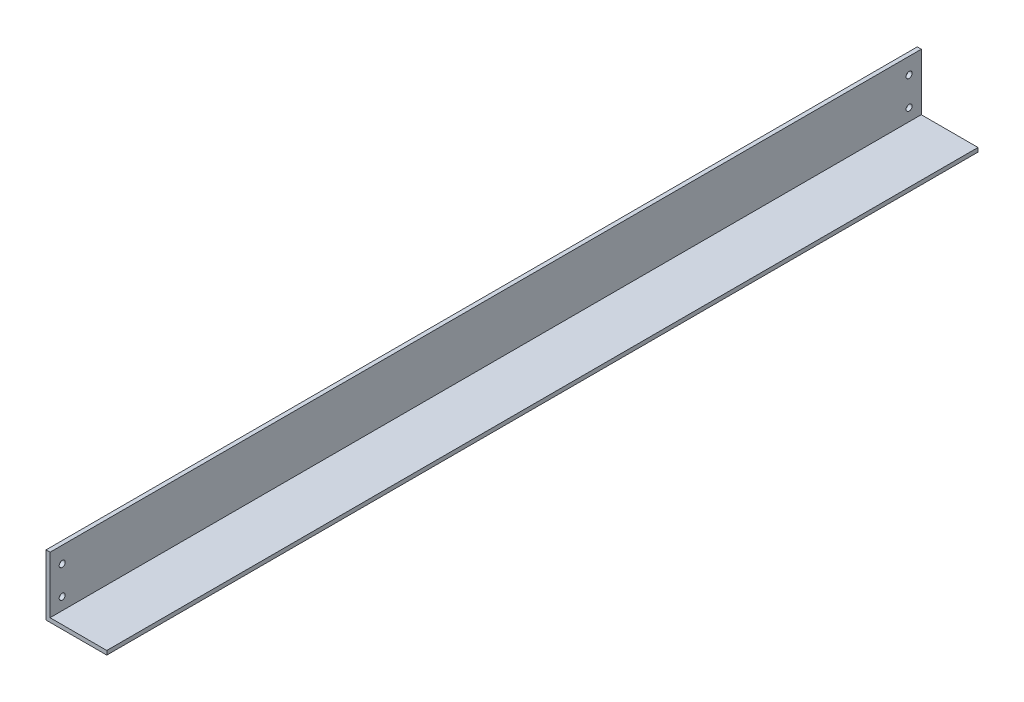
ISO-10303-21;
HEADER;
FILE_DESCRIPTION(('STEP AP214'),'2;1');
FILE_NAME('part.step','',(''),(''),'','','');
FILE_SCHEMA(('AUTOMOTIVE_DESIGN { 1 0 10303 214 1 1 1 1 }'));
ENDSEC;
DATA;
#1=APPLICATION_CONTEXT('core data for automotive mechanical design processes');
#2=APPLICATION_PROTOCOL_DEFINITION('international standard','automotive_design',2000,#1);
#3=PRODUCT_CONTEXT('',#1,'mechanical');
#4=PRODUCT('Part','Part','',(#3));
#5=PRODUCT_RELATED_PRODUCT_CATEGORY('part','',(#4));
#6=PRODUCT_DEFINITION_FORMATION('','',#4);
#7=PRODUCT_DEFINITION_CONTEXT('part definition',#1,'design');
#8=PRODUCT_DEFINITION('design','',#6,#7);
#9=PRODUCT_DEFINITION_SHAPE('','',#8);
#10=(LENGTH_UNIT() NAMED_UNIT(*) SI_UNIT(.MILLI.,.METRE.));
#11=(NAMED_UNIT(*) PLANE_ANGLE_UNIT() SI_UNIT($,.RADIAN.));
#12=(NAMED_UNIT(*) SI_UNIT($,.STERADIAN.) SOLID_ANGLE_UNIT());
#13=UNCERTAINTY_MEASURE_WITH_UNIT(LENGTH_MEASURE(1.E-05),#10,'distance_accuracy_value','');
#14=(GEOMETRIC_REPRESENTATION_CONTEXT(3) GLOBAL_UNCERTAINTY_ASSIGNED_CONTEXT((#13)) GLOBAL_UNIT_ASSIGNED_CONTEXT((#10,
#11,#12)) REPRESENTATION_CONTEXT('',''));
#15=CARTESIAN_POINT('',(0.,0.,0.));
#16=DIRECTION('',(0.,0.,1.));
#17=DIRECTION('',(1.,0.,0.));
#18=AXIS2_PLACEMENT_3D('',#15,#16,#17);
#19=CARTESIAN_POINT('',(30.,5.60231842899837,-19.999999999968));
#20=DIRECTION('',(0.,-1.,0.));
#21=DIRECTION('',(1.,0.,0.));
#22=AXIS2_PLACEMENT_3D('',#19,#20,#21);
#23=PLANE('',#22);
#24=DIRECTION('',(0.,0.,1.));
#25=VECTOR('',#24,1.);
#26=CARTESIAN_POINT('',(30.,5.60231842899837,-19.999999999968));
#27=LINE('',#26,#25);
#28=CARTESIAN_POINT('',(30.,5.60231842899837,-19.999999999968));
#29=VERTEX_POINT('',#28);
#30=CARTESIAN_POINT('',(30.,5.60231842899837,410.));
#31=VERTEX_POINT('',#30);
#32=EDGE_CURVE('E40',#29,#31,#27,.T.);
#33=ORIENTED_EDGE('',*,*,#32,.T.);
#34=DIRECTION('',(1.,0.,0.));
#35=VECTOR('',#34,1.);
#36=CARTESIAN_POINT('',(30.,5.60231842899837,410.));
#37=LINE('',#36,#35);
#38=CARTESIAN_POINT('',(0.,5.60231842899837,410.));
#39=VERTEX_POINT('',#38);
#40=EDGE_CURVE('E89',#39,#31,#37,.T.);
#41=ORIENTED_EDGE('',*,*,#40,.F.);
#42=DIRECTION('',(0.,0.,1.));
#43=VECTOR('',#42,1.);
#44=CARTESIAN_POINT('',(0.,5.60231842899837,-19.999999999968));
#45=LINE('',#44,#43);
#46=CARTESIAN_POINT('',(0.,5.60231842899837,-19.999999999968));
#47=VERTEX_POINT('',#46);
#48=EDGE_CURVE('E11',#47,#39,#45,.T.);
#49=ORIENTED_EDGE('',*,*,#48,.F.);
#50=DIRECTION('',(1.,0.,0.));
#51=VECTOR('',#50,1.);
#52=CARTESIAN_POINT('',(30.,5.60231842899837,-19.999999999968));
#53=LINE('',#52,#51);
#54=EDGE_CURVE('E90',#47,#29,#53,.T.);
#55=ORIENTED_EDGE('',*,*,#54,.T.);
#56=EDGE_LOOP('',(#33,#41,#49,#55));
#57=FACE_BOUND('',#56,.T.);
#58=ADVANCED_FACE('F37',(#57),#23,.T.);
#59=CARTESIAN_POINT('',(0.,5.60231842899837,-19.999999999968));
#60=DIRECTION('',(-1.,0.,0.));
#61=DIRECTION('',(0.,0.,1.));
#62=AXIS2_PLACEMENT_3D('',#59,#60,#61);
#63=PLANE('',#62);
#64=CARTESIAN_POINT('',(0.,13.6023184289983,404.));
#65=DIRECTION('',(1.,0.,0.));
#66=DIRECTION('',(0.,0.,-1.));
#67=AXIS2_PLACEMENT_3D('',#64,#65,#66);
#68=CIRCLE('',#67,1.49999999999999);
#69=CARTESIAN_POINT('',(0.,13.6023184289983,402.5));
#70=VERTEX_POINT('',#69);
#71=EDGE_CURVE('E200',#70,#70,#68,.T.);
#72=ORIENTED_EDGE('',*,*,#71,.T.);
#73=EDGE_LOOP('',(#72));
#74=FACE_BOUND('',#73,.T.);
#75=CARTESIAN_POINT('',(0.,27.6023184289983,404.));
#76=DIRECTION('',(1.,0.,0.));
#77=DIRECTION('',(0.,0.,-1.));
#78=AXIS2_PLACEMENT_3D('',#75,#76,#77);
#79=CIRCLE('',#78,1.49999999999999);
#80=CARTESIAN_POINT('',(0.,27.6023184289983,402.5));
#81=VERTEX_POINT('',#80);
#82=EDGE_CURVE('E210',#81,#81,#79,.T.);
#83=ORIENTED_EDGE('',*,*,#82,.T.);
#84=EDGE_LOOP('',(#83));
#85=FACE_BOUND('',#84,.T.);
#86=CARTESIAN_POINT('',(0.,27.6023184289984,-14.0000000000001));
#87=DIRECTION('',(-1.,0.,0.));
#88=DIRECTION('',(0.,0.,1.));
#89=AXIS2_PLACEMENT_3D('',#86,#87,#88);
#90=CIRCLE('',#89,1.49999999999999);
#91=CARTESIAN_POINT('',(0.,27.6023184289984,-12.5000000000001));
#92=VERTEX_POINT('',#91);
#93=EDGE_CURVE('E213',#92,#92,#90,.T.);
#94=ORIENTED_EDGE('',*,*,#93,.F.);
#95=EDGE_LOOP('',(#94));
#96=FACE_BOUND('',#95,.T.);
#97=CARTESIAN_POINT('',(0.,13.6023184289984,-14.0000000000001));
#98=DIRECTION('',(-1.,0.,0.));
#99=DIRECTION('',(0.,0.,1.));
#100=AXIS2_PLACEMENT_3D('',#97,#98,#99);
#101=CIRCLE('',#100,1.49999999999999);
#102=CARTESIAN_POINT('',(0.,13.6023184289984,-12.5000000000001));
#103=VERTEX_POINT('',#102);
#104=EDGE_CURVE('E111',#103,#103,#101,.T.);
#105=ORIENTED_EDGE('',*,*,#104,.F.);
#106=EDGE_LOOP('',(#105));
#107=FACE_BOUND('',#106,.T.);
#108=ORIENTED_EDGE('',*,*,#48,.T.);
#109=DIRECTION('',(0.,-1.,0.));
#110=VECTOR('',#109,1.);
#111=CARTESIAN_POINT('',(0.,5.60231842899837,410.));
#112=LINE('',#111,#110);
#113=CARTESIAN_POINT('',(0.,35.6023184289984,410.));
#114=VERTEX_POINT('',#113);
#115=EDGE_CURVE('E107',#114,#39,#112,.T.);
#116=ORIENTED_EDGE('',*,*,#115,.F.);
#117=DIRECTION('',(0.,0.,1.));
#118=VECTOR('',#117,1.);
#119=CARTESIAN_POINT('',(0.,35.6023184289984,-19.999999999968));
#120=LINE('',#119,#118);
#121=CARTESIAN_POINT('',(0.,35.6023184289984,-19.999999999968));
#122=VERTEX_POINT('',#121);
#123=EDGE_CURVE('E45',#122,#114,#120,.T.);
#124=ORIENTED_EDGE('',*,*,#123,.F.);
#125=DIRECTION('',(0.,-1.,0.));
#126=VECTOR('',#125,1.);
#127=CARTESIAN_POINT('',(0.,5.60231842899837,-19.999999999968));
#128=LINE('',#127,#126);
#129=EDGE_CURVE('E95',#122,#47,#128,.T.);
#130=ORIENTED_EDGE('',*,*,#129,.T.);
#131=EDGE_LOOP('',(#108,#116,#124,#130));
#132=FACE_BOUND('',#131,.T.);
#133=ADVANCED_FACE('F152',(#74,#85,#96,#107,#132),#63,.T.);
#134=CARTESIAN_POINT('',(0.,35.6023184289984,-19.999999999968));
#135=DIRECTION('',(0.,1.,0.));
#136=DIRECTION('',(0.,0.,1.));
#137=AXIS2_PLACEMENT_3D('',#134,#135,#136);
#138=PLANE('',#137);
#139=ORIENTED_EDGE('',*,*,#123,.T.);
#140=DIRECTION('',(-1.,0.,0.));
#141=VECTOR('',#140,1.);
#142=CARTESIAN_POINT('',(0.,35.6023184289984,410.));
#143=LINE('',#142,#141);
#144=CARTESIAN_POINT('',(2.,35.6023184289984,410.));
#145=VERTEX_POINT('',#144);
#146=EDGE_CURVE('E119',#145,#114,#143,.T.);
#147=ORIENTED_EDGE('',*,*,#146,.F.);
#148=DIRECTION('',(0.,0.,1.));
#149=VECTOR('',#148,1.);
#150=CARTESIAN_POINT('',(2.,35.6023184289984,-19.999999999968));
#151=LINE('',#150,#149);
#152=CARTESIAN_POINT('',(2.,35.6023184289984,-19.999999999968));
#153=VERTEX_POINT('',#152);
#154=EDGE_CURVE('E135',#153,#145,#151,.T.);
#155=ORIENTED_EDGE('',*,*,#154,.F.);
#156=DIRECTION('',(-1.,0.,0.));
#157=VECTOR('',#156,1.);
#158=CARTESIAN_POINT('',(0.,35.6023184289984,-19.999999999968));
#159=LINE('',#158,#157);
#160=EDGE_CURVE('E131',#153,#122,#159,.T.);
#161=ORIENTED_EDGE('',*,*,#160,.T.);
#162=EDGE_LOOP('',(#139,#147,#155,#161));
#163=FACE_BOUND('',#162,.T.);
#164=ADVANCED_FACE('F148',(#163),#138,.T.);
#165=CARTESIAN_POINT('',(2.,35.6023184289984,-19.999999999968));
#166=DIRECTION('',(1.,0.,0.));
#167=DIRECTION('',(0.,1.,0.));
#168=AXIS2_PLACEMENT_3D('',#165,#166,#167);
#169=PLANE('',#168);
#170=CARTESIAN_POINT('',(1.99999999999997,13.6023184289983,404.));
#171=DIRECTION('',(1.,0.,0.));
#172=DIRECTION('',(0.,0.,-1.));
#173=AXIS2_PLACEMENT_3D('',#170,#171,#172);
#174=CIRCLE('',#173,1.49999999999999);
#175=CARTESIAN_POINT('',(1.99999999999997,13.6023184289983,402.5));
#176=VERTEX_POINT('',#175);
#177=EDGE_CURVE('E203',#176,#176,#174,.T.);
#178=ORIENTED_EDGE('',*,*,#177,.F.);
#179=EDGE_LOOP('',(#178));
#180=FACE_BOUND('',#179,.T.);
#181=CARTESIAN_POINT('',(1.99999999999997,27.6023184289983,404.));
#182=DIRECTION('',(1.,0.,0.));
#183=DIRECTION('',(0.,0.,-1.));
#184=AXIS2_PLACEMENT_3D('',#181,#182,#183);
#185=CIRCLE('',#184,1.49999999999999);
#186=CARTESIAN_POINT('',(1.99999999999997,27.6023184289983,402.5));
#187=VERTEX_POINT('',#186);
#188=EDGE_CURVE('E205',#187,#187,#185,.T.);
#189=ORIENTED_EDGE('',*,*,#188,.F.);
#190=EDGE_LOOP('',(#189));
#191=FACE_BOUND('',#190,.T.);
#192=CARTESIAN_POINT('',(2.,27.6023184289984,-14.0000000000001));
#193=DIRECTION('',(1.,0.,0.));
#194=DIRECTION('',(0.,1.,0.));
#195=AXIS2_PLACEMENT_3D('',#192,#193,#194);
#196=CIRCLE('',#195,1.49999999999999);
#197=CARTESIAN_POINT('',(2.,29.1023184289984,-14.0000000000001));
#198=VERTEX_POINT('',#197);
#199=EDGE_CURVE('E216',#198,#198,#196,.T.);
#200=ORIENTED_EDGE('',*,*,#199,.F.);
#201=EDGE_LOOP('',(#200));
#202=FACE_BOUND('',#201,.T.);
#203=CARTESIAN_POINT('',(2.,13.6023184289984,-14.0000000000001));
#204=DIRECTION('',(1.,0.,0.));
#205=DIRECTION('',(0.,1.,0.));
#206=AXIS2_PLACEMENT_3D('',#203,#204,#205);
#207=CIRCLE('',#206,1.49999999999999);
#208=CARTESIAN_POINT('',(2.,15.1023184289984,-14.0000000000001));
#209=VERTEX_POINT('',#208);
#210=EDGE_CURVE('E108',#209,#209,#207,.T.);
#211=ORIENTED_EDGE('',*,*,#210,.F.);
#212=EDGE_LOOP('',(#211));
#213=FACE_BOUND('',#212,.T.);
#214=ORIENTED_EDGE('',*,*,#154,.T.);
#215=DIRECTION('',(0.,1.,0.));
#216=VECTOR('',#215,1.);
#217=CARTESIAN_POINT('',(2.,35.6023184289984,410.));
#218=LINE('',#217,#216);
#219=CARTESIAN_POINT('',(2.,7.60231842899837,410.));
#220=VERTEX_POINT('',#219);
#221=EDGE_CURVE('E116',#220,#145,#218,.T.);
#222=ORIENTED_EDGE('',*,*,#221,.F.);
#223=DIRECTION('',(0.,0.,1.));
#224=VECTOR('',#223,1.);
#225=CARTESIAN_POINT('',(2.,7.60231842899837,-19.999999999968));
#226=LINE('',#225,#224);
#227=CARTESIAN_POINT('',(2.,7.60231842899837,-19.999999999968));
#228=VERTEX_POINT('',#227);
#229=EDGE_CURVE('E137',#228,#220,#226,.T.);
#230=ORIENTED_EDGE('',*,*,#229,.F.);
#231=DIRECTION('',(0.,1.,0.));
#232=VECTOR('',#231,1.);
#233=CARTESIAN_POINT('',(2.,35.6023184289984,-19.999999999968));
#234=LINE('',#233,#232);
#235=EDGE_CURVE('E128',#228,#153,#234,.T.);
#236=ORIENTED_EDGE('',*,*,#235,.T.);
#237=EDGE_LOOP('',(#214,#222,#230,#236));
#238=FACE_BOUND('',#237,.T.);
#239=ADVANCED_FACE('F145',(#180,#191,#202,#213,#238),#169,.T.);
#240=CARTESIAN_POINT('',(2.,7.60231842899837,-19.999999999968));
#241=DIRECTION('',(0.,1.,0.));
#242=DIRECTION('',(0.,0.,1.));
#243=AXIS2_PLACEMENT_3D('',#240,#241,#242);
#244=PLANE('',#243);
#245=ORIENTED_EDGE('',*,*,#229,.T.);
#246=DIRECTION('',(-1.,0.,0.));
#247=VECTOR('',#246,1.);
#248=CARTESIAN_POINT('',(2.,7.60231842899837,410.));
#249=LINE('',#248,#247);
#250=CARTESIAN_POINT('',(30.,7.60231842899837,410.));
#251=VERTEX_POINT('',#250);
#252=EDGE_CURVE('E102',#251,#220,#249,.T.);
#253=ORIENTED_EDGE('',*,*,#252,.F.);
#254=DIRECTION('',(0.,0.,1.));
#255=VECTOR('',#254,1.);
#256=CARTESIAN_POINT('',(30.,7.60231842899837,-19.999999999968));
#257=LINE('',#256,#255);
#258=CARTESIAN_POINT('',(30.,7.60231842899837,-19.999999999968));
#259=VERTEX_POINT('',#258);
#260=EDGE_CURVE('E94',#259,#251,#257,.T.);
#261=ORIENTED_EDGE('',*,*,#260,.F.);
#262=DIRECTION('',(-1.,0.,0.));
#263=VECTOR('',#262,1.);
#264=CARTESIAN_POINT('',(2.,7.60231842899837,-19.999999999968));
#265=LINE('',#264,#263);
#266=EDGE_CURVE('E125',#259,#228,#265,.T.);
#267=ORIENTED_EDGE('',*,*,#266,.T.);
#268=EDGE_LOOP('',(#245,#253,#261,#267));
#269=FACE_BOUND('',#268,.T.);
#270=ADVANCED_FACE('F139',(#269),#244,.T.);
#271=CARTESIAN_POINT('',(30.,7.60231842899837,-19.999999999968));
#272=DIRECTION('',(1.,0.,0.));
#273=DIRECTION('',(0.,0.,-1.));
#274=AXIS2_PLACEMENT_3D('',#271,#272,#273);
#275=PLANE('',#274);
#276=ORIENTED_EDGE('',*,*,#260,.T.);
#277=DIRECTION('',(0.,1.,0.));
#278=VECTOR('',#277,1.);
#279=CARTESIAN_POINT('',(30.,7.60231842899837,410.));
#280=LINE('',#279,#278);
#281=EDGE_CURVE('E97',#31,#251,#280,.T.);
#282=ORIENTED_EDGE('',*,*,#281,.F.);
#283=ORIENTED_EDGE('',*,*,#32,.F.);
#284=DIRECTION('',(0.,1.,0.));
#285=VECTOR('',#284,1.);
#286=CARTESIAN_POINT('',(30.,7.60231842899837,-19.999999999968));
#287=LINE('',#286,#285);
#288=EDGE_CURVE('E123',#29,#259,#287,.T.);
#289=ORIENTED_EDGE('',*,*,#288,.T.);
#290=EDGE_LOOP('',(#276,#282,#283,#289));
#291=FACE_BOUND('',#290,.T.);
#292=ADVANCED_FACE('F98',(#291),#275,.T.);
#293=CARTESIAN_POINT('',(0.,0.,-19.999999999968));
#294=DIRECTION('',(0.,0.,-1.));
#295=DIRECTION('',(-1.,0.,0.));
#296=AXIS2_PLACEMENT_3D('',#293,#294,#295);
#297=PLANE('',#296);
#298=ORIENTED_EDGE('',*,*,#54,.F.);
#299=ORIENTED_EDGE('',*,*,#129,.F.);
#300=ORIENTED_EDGE('',*,*,#160,.F.);
#301=ORIENTED_EDGE('',*,*,#235,.F.);
#302=ORIENTED_EDGE('',*,*,#266,.F.);
#303=ORIENTED_EDGE('',*,*,#288,.F.);
#304=EDGE_LOOP('',(#298,#299,#300,#301,#302,#303));
#305=FACE_BOUND('',#304,.T.);
#306=ADVANCED_FACE('F151',(#305),#297,.T.);
#307=CARTESIAN_POINT('',(0.,0.,410.));
#308=DIRECTION('',(0.,0.,-1.));
#309=DIRECTION('',(-1.,0.,0.));
#310=AXIS2_PLACEMENT_3D('',#307,#308,#309);
#311=PLANE('',#310);
#312=ORIENTED_EDGE('',*,*,#40,.T.);
#313=ORIENTED_EDGE('',*,*,#281,.T.);
#314=ORIENTED_EDGE('',*,*,#252,.T.);
#315=ORIENTED_EDGE('',*,*,#221,.T.);
#316=ORIENTED_EDGE('',*,*,#146,.T.);
#317=ORIENTED_EDGE('',*,*,#115,.T.);
#318=EDGE_LOOP('',(#312,#313,#314,#315,#316,#317));
#319=FACE_BOUND('',#318,.T.);
#320=ADVANCED_FACE('F105',(#319),#311,.F.);
#321=CARTESIAN_POINT('',(0.,13.6023184289984,-14.0000000000001));
#322=DIRECTION('',(-1.,0.,0.));
#323=DIRECTION('',(0.,0.,1.));
#324=AXIS2_PLACEMENT_3D('',#321,#322,#323);
#325=CYLINDRICAL_SURFACE('',#324,1.49999999999999);
#326=ORIENTED_EDGE('',*,*,#210,.T.);
#327=EDGE_LOOP('',(#326));
#328=FACE_BOUND('',#327,.T.);
#329=ORIENTED_EDGE('',*,*,#104,.T.);
#330=EDGE_LOOP('',(#329));
#331=FACE_BOUND('',#330,.T.);
#332=ADVANCED_FACE('F178',(#328,#331),#325,.F.);
#333=CARTESIAN_POINT('',(0.,27.6023184289984,-14.0000000000001));
#334=DIRECTION('',(-1.,0.,0.));
#335=DIRECTION('',(0.,0.,1.));
#336=AXIS2_PLACEMENT_3D('',#333,#334,#335);
#337=CYLINDRICAL_SURFACE('',#336,1.49999999999999);
#338=ORIENTED_EDGE('',*,*,#199,.T.);
#339=EDGE_LOOP('',(#338));
#340=FACE_BOUND('',#339,.T.);
#341=ORIENTED_EDGE('',*,*,#93,.T.);
#342=EDGE_LOOP('',(#341));
#343=FACE_BOUND('',#342,.T.);
#344=ADVANCED_FACE('F182',(#340,#343),#337,.F.);
#345=CARTESIAN_POINT('',(1.99999999999997,27.6023184289983,404.));
#346=DIRECTION('',(1.,0.,0.));
#347=DIRECTION('',(0.,0.,-1.));
#348=AXIS2_PLACEMENT_3D('',#345,#346,#347);
#349=CYLINDRICAL_SURFACE('',#348,1.49999999999999);
#350=ORIENTED_EDGE('',*,*,#82,.F.);
#351=EDGE_LOOP('',(#350));
#352=FACE_BOUND('',#351,.T.);
#353=ORIENTED_EDGE('',*,*,#188,.T.);
#354=EDGE_LOOP('',(#353));
#355=FACE_BOUND('',#354,.T.);
#356=ADVANCED_FACE('F188',(#352,#355),#349,.F.);
#357=CARTESIAN_POINT('',(1.99999999999997,13.6023184289983,404.));
#358=DIRECTION('',(1.,0.,0.));
#359=DIRECTION('',(0.,0.,-1.));
#360=AXIS2_PLACEMENT_3D('',#357,#358,#359);
#361=CYLINDRICAL_SURFACE('',#360,1.49999999999999);
#362=ORIENTED_EDGE('',*,*,#71,.F.);
#363=EDGE_LOOP('',(#362));
#364=FACE_BOUND('',#363,.T.);
#365=ORIENTED_EDGE('',*,*,#177,.T.);
#366=EDGE_LOOP('',(#365));
#367=FACE_BOUND('',#366,.T.);
#368=ADVANCED_FACE('F192',(#364,#367),#361,.F.);
#369=CLOSED_SHELL('',(#58,#133,#164,#239,#270,#292,#306,#320,#332,#344,#356,#368));
#370=MANIFOLD_SOLID_BREP('B2',#369);
#371=ADVANCED_BREP_SHAPE_REPRESENTATION('',(#18,#370),#14);
#372=SHAPE_DEFINITION_REPRESENTATION(#9,#371);
ENDSEC;
END-ISO-10303-21;
